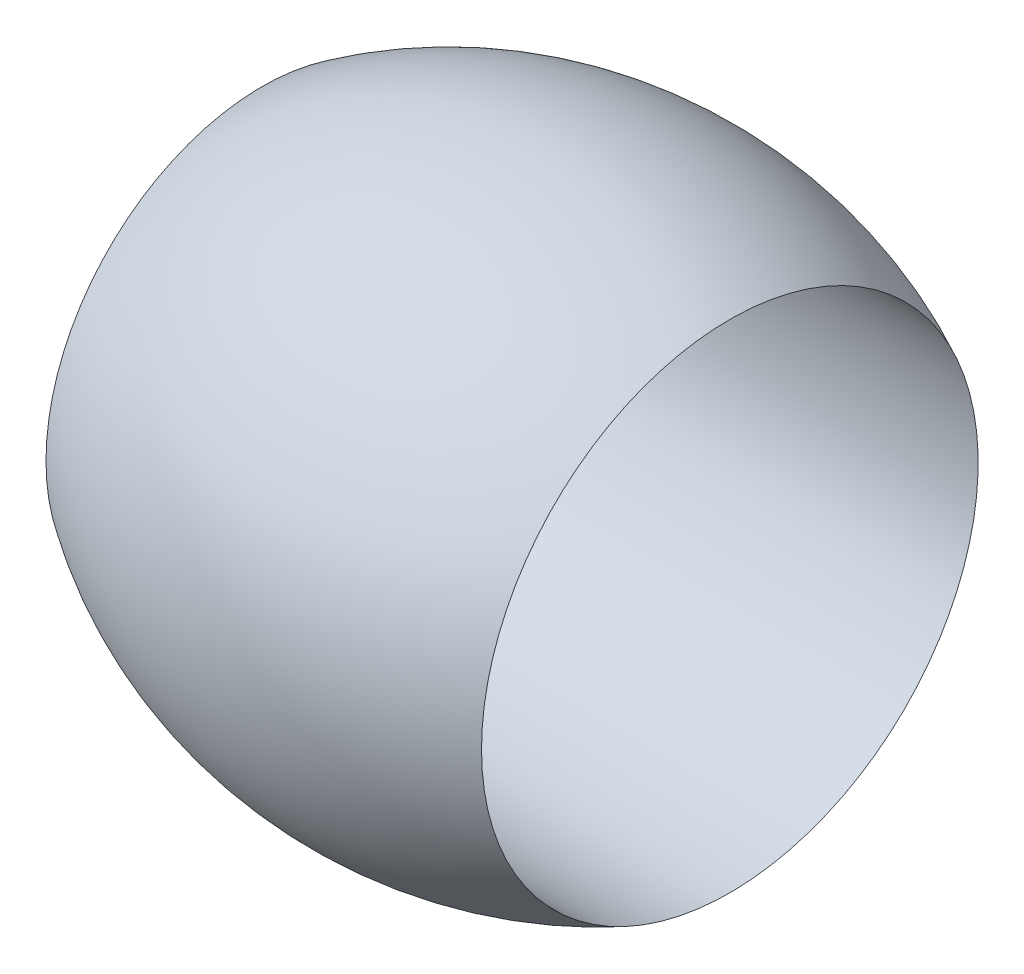
ISO-10303-21;
HEADER;
FILE_DESCRIPTION(('STEP AP214'),'2;1');
FILE_NAME('part.step','',(''),(''),'','','');
FILE_SCHEMA(('AUTOMOTIVE_DESIGN { 1 0 10303 214 1 1 1 1 }'));
ENDSEC;
DATA;
#1=APPLICATION_CONTEXT('core data for automotive mechanical design processes');
#2=APPLICATION_PROTOCOL_DEFINITION('international standard','automotive_design',2000,#1);
#3=PRODUCT_CONTEXT('',#1,'mechanical');
#4=PRODUCT('Part','Part','',(#3));
#5=PRODUCT_RELATED_PRODUCT_CATEGORY('part','',(#4));
#6=PRODUCT_DEFINITION_FORMATION('','',#4);
#7=PRODUCT_DEFINITION_CONTEXT('part definition',#1,'design');
#8=PRODUCT_DEFINITION('design','',#6,#7);
#9=PRODUCT_DEFINITION_SHAPE('','',#8);
#10=(LENGTH_UNIT() NAMED_UNIT(*) SI_UNIT(.MILLI.,.METRE.));
#11=(NAMED_UNIT(*) PLANE_ANGLE_UNIT() SI_UNIT($,.RADIAN.));
#12=(NAMED_UNIT(*) SI_UNIT($,.STERADIAN.) SOLID_ANGLE_UNIT());
#13=UNCERTAINTY_MEASURE_WITH_UNIT(LENGTH_MEASURE(1.E-05),#10,'distance_accuracy_value','');
#14=(GEOMETRIC_REPRESENTATION_CONTEXT(3) GLOBAL_UNCERTAINTY_ASSIGNED_CONTEXT((#13)) GLOBAL_UNIT_ASSIGNED_CONTEXT((#10,
#11,#12)) REPRESENTATION_CONTEXT('',''));
#15=CARTESIAN_POINT('',(0.,0.,0.));
#16=DIRECTION('',(0.,0.,1.));
#17=DIRECTION('',(1.,0.,0.));
#18=AXIS2_PLACEMENT_3D('',#15,#16,#17);
#19=CARTESIAN_POINT('',(-30.226,36.0045,0.));
#20=DIRECTION('',(-1.,0.,0.));
#21=DIRECTION('',(0.,0.,1.));
#22=AXIS2_PLACEMENT_3D('',#19,#20,#21);
#23=PLANE('',#22);
#24=CARTESIAN_POINT('',(-30.226,0.,0.));
#25=DIRECTION('',(-1.,0.,0.));
#26=DIRECTION('',(0.,0.,1.));
#27=AXIS2_PLACEMENT_3D('',#24,#25,#26);
#28=CIRCLE('',#27,40.8874370662824);
#29=CARTESIAN_POINT('',(-30.226,0.,40.8874370662824));
#30=VERTEX_POINT('',#29);
#31=EDGE_CURVE('E10',#30,#30,#28,.F.);
#32=ORIENTED_EDGE('',*,*,#31,.T.);
#33=EDGE_LOOP('',(#32));
#34=FACE_BOUND('',#33,.T.);
#35=CARTESIAN_POINT('',(-30.226,0.,0.));
#36=DIRECTION('',(-1.,0.,0.));
#37=DIRECTION('',(0.,0.,1.));
#38=AXIS2_PLACEMENT_3D('',#35,#36,#37);
#39=CIRCLE('',#38,36.0045);
#40=CARTESIAN_POINT('',(-30.226,0.,36.0045));
#41=VERTEX_POINT('',#40);
#42=EDGE_CURVE('E76',#41,#41,#39,.T.);
#43=ORIENTED_EDGE('',*,*,#42,.T.);
#44=EDGE_LOOP('',(#43));
#45=FACE_BOUND('',#44,.T.);
#46=ADVANCED_FACE('F35',(#34,#45),#23,.F.);
#47=CARTESIAN_POINT('',(-42.418,0.,0.));
#48=DIRECTION('',(-1.,0.,0.));
#49=DIRECTION('',(0.,0.,1.));
#50=AXIS2_PLACEMENT_3D('',#47,#48,#49);
#51=CYLINDRICAL_SURFACE('',#50,43.4274370662824);
#52=CARTESIAN_POINT('',(-27.686,0.,0.));
#53=DIRECTION('',(-1.,0.,0.));
#54=DIRECTION('',(0.,0.,1.));
#55=AXIS2_PLACEMENT_3D('',#52,#53,#54);
#56=CIRCLE('',#55,43.4274370662824);
#57=CARTESIAN_POINT('',(-27.686,0.,43.4274370662824));
#58=VERTEX_POINT('',#57);
#59=EDGE_CURVE('E42',#58,#58,#56,.T.);
#60=ORIENTED_EDGE('',*,*,#59,.T.);
#61=EDGE_LOOP('',(#60));
#62=FACE_BOUND('',#61,.T.);
#63=CARTESIAN_POINT('',(36.0780772025625,0.,0.));
#64=DIRECTION('',(-1.,0.,0.));
#65=DIRECTION('',(0.,0.,1.));
#66=AXIS2_PLACEMENT_3D('',#63,#64,#65);
#67=CIRCLE('',#66,43.4274370662824);
#68=CARTESIAN_POINT('',(36.0780772025625,0.,43.4274370662824));
#69=VERTEX_POINT('',#68);
#70=EDGE_CURVE('E46',#69,#69,#67,.T.);
#71=ORIENTED_EDGE('',*,*,#70,.F.);
#72=EDGE_LOOP('',(#71));
#73=FACE_BOUND('',#72,.T.);
#74=ADVANCED_FACE('F122',(#62,#73),#51,.F.);
#75=CARTESIAN_POINT('',(0.,0.,0.));
#76=DIRECTION('',(-1.,0.,0.));
#77=DIRECTION('',(0.,0.,1.));
#78=AXIS2_PLACEMENT_3D('',#75,#76,#77);
#79=DEGENERATE_TOROIDAL_SURFACE('',#78,29.4066946671703,81.28,.F.);
#80=CARTESIAN_POINT('',(-45.72,0.,0.));
#81=DIRECTION('',(-1.,0.,0.));
#82=DIRECTION('',(0.,0.,1.));
#83=AXIS2_PLACEMENT_3D('',#80,#81,#82);
#84=CIRCLE('',#83,37.7953886338703);
#85=CARTESIAN_POINT('',(-45.72,0.,37.7953886338703));
#86=VERTEX_POINT('',#85);
#87=EDGE_CURVE('E50',#86,#86,#84,.T.);
#88=ORIENTED_EDGE('',*,*,#87,.F.);
#89=EDGE_LOOP('',(#88));
#90=FACE_BOUND('',#89,.T.);
#91=ORIENTED_EDGE('',*,*,#70,.T.);
#92=EDGE_LOOP('',(#91));
#93=FACE_BOUND('',#92,.T.);
#94=ADVANCED_FACE('F127',(#90,#93),#79,.F.);
#95=CARTESIAN_POINT('',(-45.72,37.7953886338703,0.));
#96=DIRECTION('',(1.,0.,0.));
#97=DIRECTION('',(0.,0.,-1.));
#98=AXIS2_PLACEMENT_3D('',#95,#96,#97);
#99=PLANE('',#98);
#100=CARTESIAN_POINT('',(-45.72,0.,0.));
#101=DIRECTION('',(-1.,0.,0.));
#102=DIRECTION('',(0.,0.,1.));
#103=AXIS2_PLACEMENT_3D('',#100,#101,#102);
#104=CIRCLE('',#103,19.05);
#105=CARTESIAN_POINT('',(-45.72,0.,19.05));
#106=VERTEX_POINT('',#105);
#107=EDGE_CURVE('E55',#106,#106,#104,.T.);
#108=ORIENTED_EDGE('',*,*,#107,.F.);
#109=EDGE_LOOP('',(#108));
#110=FACE_BOUND('',#109,.T.);
#111=ORIENTED_EDGE('',*,*,#87,.T.);
#112=EDGE_LOOP('',(#111));
#113=FACE_BOUND('',#112,.T.);
#114=ADVANCED_FACE('F132',(#110,#113),#99,.F.);
#115=CARTESIAN_POINT('',(-42.418,0.,0.));
#116=DIRECTION('',(-1.,0.,0.));
#117=DIRECTION('',(0.,0.,1.));
#118=AXIS2_PLACEMENT_3D('',#115,#116,#117);
#119=CYLINDRICAL_SURFACE('',#118,19.05);
#120=CARTESIAN_POINT('',(-42.418,0.,0.));
#121=DIRECTION('',(-1.,0.,0.));
#122=DIRECTION('',(0.,0.,1.));
#123=AXIS2_PLACEMENT_3D('',#120,#121,#122);
#124=CIRCLE('',#123,19.05);
#125=CARTESIAN_POINT('',(-42.418,0.,19.05));
#126=VERTEX_POINT('',#125);
#127=EDGE_CURVE('E58',#126,#126,#124,.T.);
#128=ORIENTED_EDGE('',*,*,#127,.F.);
#129=EDGE_LOOP('',(#128));
#130=FACE_BOUND('',#129,.T.);
#131=ORIENTED_EDGE('',*,*,#107,.T.);
#132=EDGE_LOOP('',(#131));
#133=FACE_BOUND('',#132,.T.);
#134=ADVANCED_FACE('F118',(#130,#133),#119,.F.);
#135=CARTESIAN_POINT('',(-42.418,19.05,0.));
#136=DIRECTION('',(1.,0.,0.));
#137=DIRECTION('',(0.,0.,-1.));
#138=AXIS2_PLACEMENT_3D('',#135,#136,#137);
#139=PLANE('',#138);
#140=ORIENTED_EDGE('',*,*,#127,.T.);
#141=EDGE_LOOP('',(#140));
#142=FACE_BOUND('',#141,.T.);
#143=ADVANCED_FACE('F113',(#142),#139,.F.);
#144=CARTESIAN_POINT('',(-38.608,0.,0.));
#145=DIRECTION('',(-1.,0.,0.));
#146=DIRECTION('',(0.,0.,1.));
#147=AXIS2_PLACEMENT_3D('',#144,#145,#146);
#148=PLANE('',#147);
#149=CARTESIAN_POINT('',(-38.608,0.,0.));
#150=DIRECTION('',(-1.,0.,0.));
#151=DIRECTION('',(0.,0.,1.));
#152=AXIS2_PLACEMENT_3D('',#149,#150,#151);
#153=CIRCLE('',#152,22.86);
#154=CARTESIAN_POINT('',(-38.608,0.,22.86));
#155=VERTEX_POINT('',#154);
#156=EDGE_CURVE('E61',#155,#155,#153,.T.);
#157=ORIENTED_EDGE('',*,*,#156,.F.);
#158=EDGE_LOOP('',(#157));
#159=FACE_BOUND('',#158,.T.);
#160=ADVANCED_FACE('F108',(#159),#148,.F.);
#161=CARTESIAN_POINT('',(-42.418,0.,0.));
#162=DIRECTION('',(-1.,0.,0.));
#163=DIRECTION('',(0.,0.,1.));
#164=AXIS2_PLACEMENT_3D('',#161,#162,#163);
#165=CYLINDRICAL_SURFACE('',#164,22.86);
#166=CARTESIAN_POINT('',(-42.21,0.,0.));
#167=DIRECTION('',(-1.,0.,0.));
#168=DIRECTION('',(0.,0.,1.));
#169=AXIS2_PLACEMENT_3D('',#166,#167,#168);
#170=CIRCLE('',#169,22.86);
#171=CARTESIAN_POINT('',(-42.21,0.,22.86));
#172=VERTEX_POINT('',#171);
#173=EDGE_CURVE('E64',#172,#172,#170,.T.);
#174=ORIENTED_EDGE('',*,*,#173,.F.);
#175=EDGE_LOOP('',(#174));
#176=FACE_BOUND('',#175,.T.);
#177=ORIENTED_EDGE('',*,*,#156,.T.);
#178=EDGE_LOOP('',(#177));
#179=FACE_BOUND('',#178,.T.);
#180=ADVANCED_FACE('F102',(#176,#179),#165,.T.);
#181=CARTESIAN_POINT('',(-42.21,31.75,0.));
#182=DIRECTION('',(-1.,0.,0.));
#183=DIRECTION('',(0.,0.,1.));
#184=AXIS2_PLACEMENT_3D('',#181,#182,#183);
#185=PLANE('',#184);
#186=CARTESIAN_POINT('',(-42.21,0.,0.));
#187=DIRECTION('',(-1.,0.,0.));
#188=DIRECTION('',(0.,0.,1.));
#189=AXIS2_PLACEMENT_3D('',#186,#187,#188);
#190=CIRCLE('',#189,31.75);
#191=CARTESIAN_POINT('',(-42.21,0.,31.75));
#192=VERTEX_POINT('',#191);
#193=EDGE_CURVE('E67',#192,#192,#190,.T.);
#194=ORIENTED_EDGE('',*,*,#193,.F.);
#195=EDGE_LOOP('',(#194));
#196=FACE_BOUND('',#195,.T.);
#197=ORIENTED_EDGE('',*,*,#173,.T.);
#198=EDGE_LOOP('',(#197));
#199=FACE_BOUND('',#198,.T.);
#200=ADVANCED_FACE('F96',(#196,#199),#185,.F.);
#201=CARTESIAN_POINT('',(-42.418,0.,0.));
#202=DIRECTION('',(-1.,0.,0.));
#203=DIRECTION('',(0.,0.,1.));
#204=AXIS2_PLACEMENT_3D('',#201,#202,#203);
#205=CYLINDRICAL_SURFACE('',#204,31.75);
#206=CARTESIAN_POINT('',(-41.91,0.,0.));
#207=DIRECTION('',(-1.,0.,0.));
#208=DIRECTION('',(0.,0.,1.));
#209=AXIS2_PLACEMENT_3D('',#206,#207,#208);
#210=CIRCLE('',#209,31.75);
#211=CARTESIAN_POINT('',(-41.91,0.,31.75));
#212=VERTEX_POINT('',#211);
#213=EDGE_CURVE('E70',#212,#212,#210,.T.);
#214=ORIENTED_EDGE('',*,*,#213,.F.);
#215=EDGE_LOOP('',(#214));
#216=FACE_BOUND('',#215,.T.);
#217=ORIENTED_EDGE('',*,*,#193,.T.);
#218=EDGE_LOOP('',(#217));
#219=FACE_BOUND('',#218,.T.);
#220=ADVANCED_FACE('F90',(#216,#219),#205,.F.);
#221=CARTESIAN_POINT('',(-41.91,31.75,0.));
#222=DIRECTION('',(-1.,0.,0.));
#223=DIRECTION('',(0.,0.,1.));
#224=AXIS2_PLACEMENT_3D('',#221,#222,#223);
#225=PLANE('',#224);
#226=CARTESIAN_POINT('',(-41.91,0.,0.));
#227=DIRECTION('',(-1.,0.,0.));
#228=DIRECTION('',(0.,0.,1.));
#229=AXIS2_PLACEMENT_3D('',#226,#227,#228);
#230=CIRCLE('',#229,36.0045);
#231=CARTESIAN_POINT('',(-41.91,0.,36.0045));
#232=VERTEX_POINT('',#231);
#233=EDGE_CURVE('E73',#232,#232,#230,.T.);
#234=ORIENTED_EDGE('',*,*,#233,.F.);
#235=EDGE_LOOP('',(#234));
#236=FACE_BOUND('',#235,.T.);
#237=ORIENTED_EDGE('',*,*,#213,.T.);
#238=EDGE_LOOP('',(#237));
#239=FACE_BOUND('',#238,.T.);
#240=ADVANCED_FACE('F84',(#236,#239),#225,.F.);
#241=CARTESIAN_POINT('',(-42.418,0.,0.));
#242=DIRECTION('',(-1.,0.,0.));
#243=DIRECTION('',(0.,0.,1.));
#244=AXIS2_PLACEMENT_3D('',#241,#242,#243);
#245=CYLINDRICAL_SURFACE('',#244,36.0045);
#246=ORIENTED_EDGE('',*,*,#42,.F.);
#247=EDGE_LOOP('',(#246));
#248=FACE_BOUND('',#247,.T.);
#249=ORIENTED_EDGE('',*,*,#233,.T.);
#250=EDGE_LOOP('',(#249));
#251=FACE_BOUND('',#250,.T.);
#252=ADVANCED_FACE('F81',(#248,#251),#245,.F.);
#253=CARTESIAN_POINT('',(-27.686,0.,0.));
#254=DIRECTION('',(-1.,0.,0.));
#255=DIRECTION('',(0.,0.,1.));
#256=AXIS2_PLACEMENT_3D('',#253,#254,#255);
#257=TOROIDAL_SURFACE('',#256,40.8874370662824,2.54);
#258=ORIENTED_EDGE('',*,*,#31,.F.);
#259=EDGE_LOOP('',(#258));
#260=FACE_BOUND('',#259,.T.);
#261=ORIENTED_EDGE('',*,*,#59,.F.);
#262=EDGE_LOOP('',(#261));
#263=FACE_BOUND('',#262,.T.);
#264=ADVANCED_FACE('F37',(#260,#263),#257,.F.);
#265=CLOSED_SHELL('',(#46,#74,#94,#114,#134,#143,#160,#180,#200,#220,#240,#252,#264));
#266=MANIFOLD_SOLID_BREP('B2',#265);
#267=ADVANCED_BREP_SHAPE_REPRESENTATION('',(#18,#266),#14);
#268=SHAPE_DEFINITION_REPRESENTATION(#9,#267);
ENDSEC;
END-ISO-10303-21;
